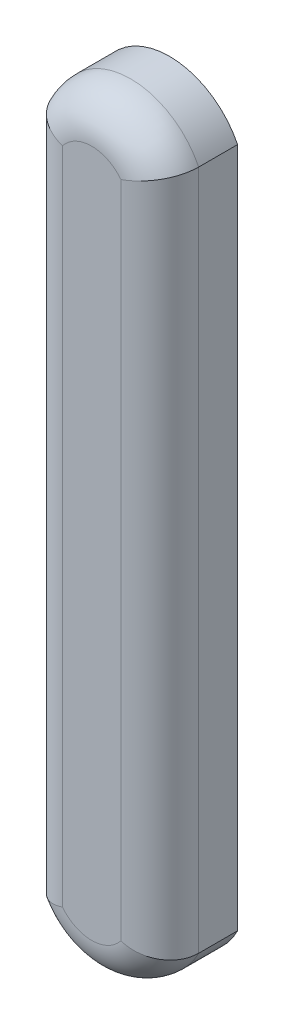
ISO-10303-21;
HEADER;
FILE_DESCRIPTION(('STEP AP214'),'2;1');
FILE_NAME('part.step','',(''),(''),'','','');
FILE_SCHEMA(('AUTOMOTIVE_DESIGN { 1 0 10303 214 1 1 1 1 }'));
ENDSEC;
DATA;
#1=APPLICATION_CONTEXT('core data for automotive mechanical design processes');
#2=APPLICATION_PROTOCOL_DEFINITION('international standard','automotive_design',2000,#1);
#3=PRODUCT_CONTEXT('',#1,'mechanical');
#4=PRODUCT('Part','Part','',(#3));
#5=PRODUCT_RELATED_PRODUCT_CATEGORY('part','',(#4));
#6=PRODUCT_DEFINITION_FORMATION('','',#4);
#7=PRODUCT_DEFINITION_CONTEXT('part definition',#1,'design');
#8=PRODUCT_DEFINITION('design','',#6,#7);
#9=PRODUCT_DEFINITION_SHAPE('','',#8);
#10=(LENGTH_UNIT() NAMED_UNIT(*) SI_UNIT(.MILLI.,.METRE.));
#11=(NAMED_UNIT(*) PLANE_ANGLE_UNIT() SI_UNIT($,.RADIAN.));
#12=(NAMED_UNIT(*) SI_UNIT($,.STERADIAN.) SOLID_ANGLE_UNIT());
#13=UNCERTAINTY_MEASURE_WITH_UNIT(LENGTH_MEASURE(1.E-05),#10,'distance_accuracy_value','');
#14=(GEOMETRIC_REPRESENTATION_CONTEXT(3) GLOBAL_UNCERTAINTY_ASSIGNED_CONTEXT((#13)) GLOBAL_UNIT_ASSIGNED_CONTEXT((#10,
#11,#12)) REPRESENTATION_CONTEXT('',''));
#15=CARTESIAN_POINT('',(0.,0.,0.));
#16=DIRECTION('',(0.,0.,1.));
#17=DIRECTION('',(1.,0.,0.));
#18=AXIS2_PLACEMENT_3D('',#15,#16,#17);
#19=CARTESIAN_POINT('',(0.175,0.085969826745946,0.2));
#20=DIRECTION('',(0.,0.,-1.));
#21=DIRECTION('',(-1.,0.,0.));
#22=AXIS2_PLACEMENT_3D('',#19,#20,#21);
#23=CYLINDRICAL_SURFACE('',#22,0.194976437321867);
#24=DIRECTION('',(0.,0.,-1.));
#25=VECTOR('',#24,1.);
#26=CARTESIAN_POINT('',(0.35,0.,0.2));
#27=LINE('',#26,#25);
#28=CARTESIAN_POINT('',(0.35,0.,0.1));
#29=VERTEX_POINT('',#28);
#30=CARTESIAN_POINT('',(0.35,0.,0.));
#31=VERTEX_POINT('',#30);
#32=EDGE_CURVE('E92',#29,#31,#27,.T.);
#33=ORIENTED_EDGE('',*,*,#32,.F.);
#34=CARTESIAN_POINT('',(0.175,0.085969826745946,0.1));
#35=DIRECTION('',(0.,0.,1.));
#36=DIRECTION('',(1.,0.,0.));
#37=AXIS2_PLACEMENT_3D('',#34,#35,#36);
#38=CIRCLE('',#37,0.194976437321867);
#39=CARTESIAN_POINT('',(0.,0.,0.1));
#40=VERTEX_POINT('',#39);
#41=EDGE_CURVE('E134',#29,#40,#38,.F.);
#42=ORIENTED_EDGE('',*,*,#41,.T.);
#43=DIRECTION('',(0.,0.,-1.));
#44=VECTOR('',#43,1.);
#45=CARTESIAN_POINT('',(0.,0.,0.2));
#46=LINE('',#45,#44);
#47=CARTESIAN_POINT('',(0.,0.,0.));
#48=VERTEX_POINT('',#47);
#49=EDGE_CURVE('E113',#40,#48,#46,.T.);
#50=ORIENTED_EDGE('',*,*,#49,.T.);
#51=CARTESIAN_POINT('',(0.175,0.085969826745946,0.));
#52=DIRECTION('',(0.,0.,1.));
#53=DIRECTION('',(1.,0.,0.));
#54=AXIS2_PLACEMENT_3D('',#51,#52,#53);
#55=CIRCLE('',#54,0.194976437321867);
#56=EDGE_CURVE('E109',#48,#31,#55,.T.);
#57=ORIENTED_EDGE('',*,*,#56,.T.);
#58=EDGE_LOOP('',(#33,#42,#50,#57));
#59=FACE_BOUND('',#58,.T.);
#60=ADVANCED_FACE('F33',(#59),#23,.T.);
#61=CARTESIAN_POINT('',(0.35,0.,0.2));
#62=DIRECTION('',(-1.,0.,0.));
#63=DIRECTION('',(0.,0.,1.));
#64=AXIS2_PLACEMENT_3D('',#61,#62,#63);
#65=PLANE('',#64);
#66=DIRECTION('',(0.,0.,-1.));
#67=VECTOR('',#66,1.);
#68=CARTESIAN_POINT('',(0.35,1.75,0.2));
#69=LINE('',#68,#67);
#70=CARTESIAN_POINT('',(0.35,1.75,0.1));
#71=VERTEX_POINT('',#70);
#72=CARTESIAN_POINT('',(0.35,1.75,0.));
#73=VERTEX_POINT('',#72);
#74=EDGE_CURVE('E103',#71,#73,#69,.T.);
#75=ORIENTED_EDGE('',*,*,#74,.F.);
#76=DIRECTION('',(0.,1.,0.));
#77=VECTOR('',#76,1.);
#78=CARTESIAN_POINT('',(0.35,0.,0.1));
#79=LINE('',#78,#77);
#80=EDGE_CURVE('E47',#71,#29,#79,.F.);
#81=ORIENTED_EDGE('',*,*,#80,.T.);
#82=ORIENTED_EDGE('',*,*,#32,.T.);
#83=DIRECTION('',(0.,1.,0.));
#84=VECTOR('',#83,1.);
#85=CARTESIAN_POINT('',(0.35,0.,0.));
#86=LINE('',#85,#84);
#87=EDGE_CURVE('E95',#31,#73,#86,.T.);
#88=ORIENTED_EDGE('',*,*,#87,.T.);
#89=EDGE_LOOP('',(#75,#81,#82,#88));
#90=FACE_BOUND('',#89,.T.);
#91=ADVANCED_FACE('F94',(#90),#65,.F.);
#92=CARTESIAN_POINT('',(0.175,1.66403017325405,0.2));
#93=DIRECTION('',(0.,0.,-1.));
#94=DIRECTION('',(-1.,0.,0.));
#95=AXIS2_PLACEMENT_3D('',#92,#93,#94);
#96=CYLINDRICAL_SURFACE('',#95,0.194976437321867);
#97=DIRECTION('',(0.,0.,-1.));
#98=VECTOR('',#97,1.);
#99=CARTESIAN_POINT('',(0.,1.75,0.2));
#100=LINE('',#99,#98);
#101=CARTESIAN_POINT('',(0.,1.75,0.1));
#102=VERTEX_POINT('',#101);
#103=CARTESIAN_POINT('',(0.,1.75,0.));
#104=VERTEX_POINT('',#103);
#105=EDGE_CURVE('E123',#102,#104,#100,.T.);
#106=ORIENTED_EDGE('',*,*,#105,.F.);
#107=CARTESIAN_POINT('',(0.175,1.66403017325405,0.1));
#108=DIRECTION('',(0.,0.,1.));
#109=DIRECTION('',(1.,0.,0.));
#110=AXIS2_PLACEMENT_3D('',#107,#108,#109);
#111=CIRCLE('',#110,0.194976437321867);
#112=EDGE_CURVE('E11',#102,#71,#111,.F.);
#113=ORIENTED_EDGE('',*,*,#112,.T.);
#114=ORIENTED_EDGE('',*,*,#74,.T.);
#115=CARTESIAN_POINT('',(0.175,1.66403017325405,0.));
#116=DIRECTION('',(0.,0.,1.));
#117=DIRECTION('',(-1.,0.,0.));
#118=AXIS2_PLACEMENT_3D('',#115,#116,#117);
#119=CIRCLE('',#118,0.194976437321867);
#120=EDGE_CURVE('E111',#73,#104,#119,.T.);
#121=ORIENTED_EDGE('',*,*,#120,.T.);
#122=EDGE_LOOP('',(#106,#113,#114,#121));
#123=FACE_BOUND('',#122,.T.);
#124=ADVANCED_FACE('F176',(#123),#96,.T.);
#125=CARTESIAN_POINT('',(0.,0.,0.2));
#126=DIRECTION('',(1.,0.,0.));
#127=DIRECTION('',(0.,0.,-1.));
#128=AXIS2_PLACEMENT_3D('',#125,#126,#127);
#129=PLANE('',#128);
#130=ORIENTED_EDGE('',*,*,#49,.F.);
#131=DIRECTION('',(0.,-1.,0.));
#132=VECTOR('',#131,1.);
#133=CARTESIAN_POINT('',(0.,1.75,0.1));
#134=LINE('',#133,#132);
#135=EDGE_CURVE('E61',#40,#102,#134,.F.);
#136=ORIENTED_EDGE('',*,*,#135,.T.);
#137=ORIENTED_EDGE('',*,*,#105,.T.);
#138=DIRECTION('',(0.,-1.,0.));
#139=VECTOR('',#138,1.);
#140=CARTESIAN_POINT('',(0.,0.,0.));
#141=LINE('',#140,#139);
#142=EDGE_CURVE('E120',#104,#48,#141,.T.);
#143=ORIENTED_EDGE('',*,*,#142,.T.);
#144=EDGE_LOOP('',(#130,#136,#137,#143));
#145=FACE_BOUND('',#144,.T.);
#146=ADVANCED_FACE('F175',(#145),#129,.F.);
#147=CARTESIAN_POINT('',(0.175,0.085969826745946,0.2));
#148=DIRECTION('',(0.,0.,1.));
#149=DIRECTION('',(1.,0.,0.));
#150=AXIS2_PLACEMENT_3D('',#147,#148,#149);
#151=PLANE('',#150);
#152=DIRECTION('',(0.,-1.,0.));
#153=VECTOR('',#152,1.);
#154=CARTESIAN_POINT('',(0.1,0.,0.2));
#155=LINE('',#154,#153);
#156=CARTESIAN_POINT('',(0.100000000000006,1.72230129514437,0.2));
#157=VERTEX_POINT('',#156);
#158=CARTESIAN_POINT('',(0.1,0.0276987048556349,0.2));
#159=VERTEX_POINT('',#158);
#160=EDGE_CURVE('E129',#157,#159,#155,.T.);
#161=ORIENTED_EDGE('',*,*,#160,.T.);
#162=CARTESIAN_POINT('',(0.175,0.085969826745946,0.2));
#163=DIRECTION('',(0.,0.,1.));
#164=DIRECTION('',(1.,0.,0.));
#165=AXIS2_PLACEMENT_3D('',#162,#163,#164);
#166=CIRCLE('',#165,0.0949764373218671);
#167=CARTESIAN_POINT('',(0.25,0.027698704855635,0.2));
#168=VERTEX_POINT('',#167);
#169=EDGE_CURVE('E131',#159,#168,#166,.T.);
#170=ORIENTED_EDGE('',*,*,#169,.T.);
#171=DIRECTION('',(0.,1.,0.));
#172=VECTOR('',#171,1.);
#173=CARTESIAN_POINT('',(0.25,1.75,0.2));
#174=LINE('',#173,#172);
#175=CARTESIAN_POINT('',(0.249999999999994,1.72230129514437,0.2));
#176=VERTEX_POINT('',#175);
#177=EDGE_CURVE('E127',#168,#176,#174,.T.);
#178=ORIENTED_EDGE('',*,*,#177,.T.);
#179=CARTESIAN_POINT('',(0.175,1.66403017325405,0.2));
#180=DIRECTION('',(0.,0.,1.));
#181=DIRECTION('',(1.,0.,0.));
#182=AXIS2_PLACEMENT_3D('',#179,#180,#181);
#183=CIRCLE('',#182,0.0949764373218671);
#184=EDGE_CURVE('E102',#176,#157,#183,.T.);
#185=ORIENTED_EDGE('',*,*,#184,.T.);
#186=EDGE_LOOP('',(#161,#170,#178,#185));
#187=FACE_BOUND('',#186,.T.);
#188=ADVANCED_FACE('F180',(#187),#151,.T.);
#189=CARTESIAN_POINT('',(0.175,0.085969826745946,0.));
#190=DIRECTION('',(0.,0.,1.));
#191=DIRECTION('',(1.,0.,0.));
#192=AXIS2_PLACEMENT_3D('',#189,#190,#191);
#193=PLANE('',#192);
#194=ORIENTED_EDGE('',*,*,#56,.F.);
#195=ORIENTED_EDGE('',*,*,#142,.F.);
#196=ORIENTED_EDGE('',*,*,#120,.F.);
#197=ORIENTED_EDGE('',*,*,#87,.F.);
#198=EDGE_LOOP('',(#194,#195,#196,#197));
#199=FACE_BOUND('',#198,.T.);
#200=ADVANCED_FACE('F107',(#199),#193,.F.);
#201=CARTESIAN_POINT('',(0.175,1.66403017325405,0.1));
#202=DIRECTION('',(0.,0.,1.));
#203=DIRECTION('',(1.,0.,0.));
#204=AXIS2_PLACEMENT_3D('',#201,#202,#203);
#205=DEGENERATE_TOROIDAL_SURFACE('',#204,0.0949764373218671,0.1,.T.);
#206=CARTESIAN_POINT('',(0.35,1.75,0.1));
#207=CARTESIAN_POINT('',(0.350005268670267,1.75000040754592,0.105511252154056));
#208=CARTESIAN_POINT('',(0.349544726083473,1.74989418803524,0.111020433796739));
#209=CARTESIAN_POINT('',(0.347731528858172,1.74947173953325,0.121874551323155));
#210=CARTESIAN_POINT('',(0.346380049196348,1.74915578713593,0.127219693839957));
#211=CARTESIAN_POINT('',(0.342823791248484,1.74831698281915,0.137602422816504));
#212=CARTESIAN_POINT('',(0.340618769337371,1.7477940718269,0.142639920990146));
#213=CARTESIAN_POINT('',(0.335428566635515,1.74654702816146,0.152267062418119));
#214=CARTESIAN_POINT('',(0.332443445191162,1.74582291079487,0.156856739704145));
#215=CARTESIAN_POINT('',(0.325756614399063,1.74417319123095,0.165506423196409));
#216=CARTESIAN_POINT('',(0.322048708236536,1.74324583736037,0.169561300463762));
#217=CARTESIAN_POINT('',(0.314048358880856,1.74120195336536,0.176991039421652));
#218=CARTESIAN_POINT('',(0.309755728604854,1.74008536266644,0.18036568261043));
#219=CARTESIAN_POINT('',(0.300608968757441,1.7376441832273,0.186426554884238));
#220=CARTESIAN_POINT('',(0.295743946563813,1.73631529375002,0.189094582015617));
#221=CARTESIAN_POINT('',(0.285685701853069,1.73347998727226,0.193577836216799));
#222=CARTESIAN_POINT('',(0.280492611405467,1.73197364150132,0.195393404007875));
#223=CARTESIAN_POINT('',(0.271464682749297,1.72925574089153,0.197746196020681));
#224=CARTESIAN_POINT('',(0.267672328405755,1.72808525366685,0.198501401199194));
#225=CARTESIAN_POINT('',(0.260055477527481,1.72566401718499,0.199567195235984));
#226=CARTESIAN_POINT('',(0.25623103898922,1.72441339335639,0.199878461996796));
#227=CARTESIAN_POINT('',(0.251610866919887,1.72285157075458,0.199990299901761));
#228=CARTESIAN_POINT('',(0.250805058561448,1.72257728559771,0.200000031817378));
#229=CARTESIAN_POINT('',(0.25,1.72230129514436,0.2));
#230=B_SPLINE_CURVE_WITH_KNOTS('',3,(#206,#207,#208,#209,#210,#211,#212,#213,#214,#215,#216,
#217,#218,#219,#220,#221,#222,#223,#224,#225,#226,#227,#228,#229),.UNSPECIFIED.,.F.,.F.,(4,2,2,
2,2,2,2,2,2,2,2,4),(0.,0.0165104363716612,0.0329991420587915,0.0494925575628399,
0.0659847186886619,0.0826250435228637,0.0992707050000555,0.116310692768043,0.133343863977416,
0.145441145514401,0.157519934417857,0.160073462740983),.UNSPECIFIED.);
#231=EDGE_CURVE('E117',#71,#176,#230,.T.);
#232=ORIENTED_EDGE('',*,*,#231,.F.);
#233=ORIENTED_EDGE('',*,*,#112,.F.);
#234=CARTESIAN_POINT('',(0.,1.75,0.1));
#235=CARTESIAN_POINT('',(-5.26867026747436E-06,1.75000040754592,0.105511252154056));
#236=CARTESIAN_POINT('',(0.00045527391652668,1.74989418803524,0.111020433796739));
#237=CARTESIAN_POINT('',(0.00226847114182761,1.74947173953325,0.121874551323155));
#238=CARTESIAN_POINT('',(0.00361995080365192,1.74915578713593,0.127219693839957));
#239=CARTESIAN_POINT('',(0.00717620875151555,1.74831698281915,0.137602422816504));
#240=CARTESIAN_POINT('',(0.00938123066262876,1.7477940718269,0.142639920990146));
#241=CARTESIAN_POINT('',(0.0145714333644853,1.74654702816146,0.152267062418119));
#242=CARTESIAN_POINT('',(0.0175565548088385,1.74582291079487,0.156856739704144));
#243=CARTESIAN_POINT('',(0.0242433856009374,1.74417319123095,0.165506423196409));
#244=CARTESIAN_POINT('',(0.0279512917634644,1.74324583736037,0.169561300463762));
#245=CARTESIAN_POINT('',(0.0359516411191435,1.74120195336536,0.176991039421652));
#246=CARTESIAN_POINT('',(0.0402442713951461,1.74008536266644,0.18036568261043));
#247=CARTESIAN_POINT('',(0.0493910312425594,1.7376441832273,0.186426554884238));
#248=CARTESIAN_POINT('',(0.0542560534361864,1.73631529375002,0.189094582015616));
#249=CARTESIAN_POINT('',(0.0643142981469308,1.73347998727226,0.193577836216799));
#250=CARTESIAN_POINT('',(0.0695073885945331,1.73197364150132,0.195393404007875));
#251=CARTESIAN_POINT('',(0.078535317250703,1.72925574089153,0.197746196020681));
#252=CARTESIAN_POINT('',(0.0823276715942444,1.72808525366685,0.198501401199194));
#253=CARTESIAN_POINT('',(0.089944522472519,1.72566401718499,0.199567195235984));
#254=CARTESIAN_POINT('',(0.09376896101078,1.72441339335639,0.199878461996796));
#255=CARTESIAN_POINT('',(0.0983891330801134,1.72285157075458,0.199990299901761));
#256=CARTESIAN_POINT('',(0.0991949414385525,1.72257728559771,0.200000031817378));
#257=CARTESIAN_POINT('',(0.1,1.72230129514436,0.2));
#258=B_SPLINE_CURVE_WITH_KNOTS('',3,(#234,#235,#236,#237,#238,#239,#240,#241,#242,#243,#244,
#245,#246,#247,#248,#249,#250,#251,#252,#253,#254,#255,#256,#257),.UNSPECIFIED.,.F.,.F.,(4,2,2,
2,2,2,2,2,2,2,2,4),(0.,0.0165104363716612,0.0329991420587914,0.0494925575628399,
0.0659847186886619,0.0826250435228636,0.0992707050000554,0.116310692768043,0.133343863977416,
0.145441145514401,0.157519934417857,0.160073462740983),.UNSPECIFIED.);
#259=EDGE_CURVE('E38',#157,#102,#258,.F.);
#260=ORIENTED_EDGE('',*,*,#259,.F.);
#261=ORIENTED_EDGE('',*,*,#184,.F.);
#262=EDGE_LOOP('',(#232,#233,#260,#261));
#263=FACE_BOUND('',#262,.T.);
#264=ADVANCED_FACE('F35',(#263),#205,.T.);
#265=CARTESIAN_POINT('',(0.1,0.085969826745946,0.1));
#266=DIRECTION('',(0.,1.,0.));
#267=DIRECTION('',(0.,0.,1.));
#268=AXIS2_PLACEMENT_3D('',#265,#266,#267);
#269=CYLINDRICAL_SURFACE('',#268,0.1);
#270=ORIENTED_EDGE('',*,*,#259,.T.);
#271=ORIENTED_EDGE('',*,*,#135,.F.);
#272=CARTESIAN_POINT('',(0.,0.,0.1));
#273=CARTESIAN_POINT('',(-5.26867026746398E-06,-4.07545918080694E-07,0.105511252154056));
#274=CARTESIAN_POINT('',(0.000455273916526692,0.000105811964755442,0.111020433796739));
#275=CARTESIAN_POINT('',(0.00226847114182762,0.000528260466754622,0.121874551323155));
#276=CARTESIAN_POINT('',(0.00361995080365192,0.000844212864070088,0.127219693839957));
#277=CARTESIAN_POINT('',(0.00717620875151555,0.00168301718085008,0.137602422816504));
#278=CARTESIAN_POINT('',(0.00938123066262875,0.00220592817310269,0.142639920990146));
#279=CARTESIAN_POINT('',(0.0145714333644852,0.00345297183853682,0.152267062418119));
#280=CARTESIAN_POINT('',(0.0175565548088385,0.00417708920512641,0.156856739704144));
#281=CARTESIAN_POINT('',(0.0242433856009374,0.00582680876905415,0.165506423196409));
#282=CARTESIAN_POINT('',(0.0279512917634644,0.00675416263962724,0.169561300463762));
#283=CARTESIAN_POINT('',(0.0359516411191436,0.00879804663464378,0.176991039421652));
#284=CARTESIAN_POINT('',(0.0402442713951461,0.0099146373335641,0.18036568261043));
#285=CARTESIAN_POINT('',(0.0493910312425594,0.0123558167727031,0.186426554884238));
#286=CARTESIAN_POINT('',(0.0542560534361864,0.0136847062499834,0.189094582015616));
#287=CARTESIAN_POINT('',(0.0643142981469308,0.0165200127277396,0.193577836216799));
#288=CARTESIAN_POINT('',(0.0695073885945331,0.0180263584986781,0.195393404007875));
#289=CARTESIAN_POINT('',(0.078535317250703,0.0207442591084678,0.197746196020681));
#290=CARTESIAN_POINT('',(0.0823276715942444,0.0219147463331537,0.198501401199194));
#291=CARTESIAN_POINT('',(0.089944522472519,0.0243359828150114,0.199567195235984));
#292=CARTESIAN_POINT('',(0.09376896101078,0.0255866066436067,0.199878461996796));
#293=CARTESIAN_POINT('',(0.0983891330801134,0.027148429245421,0.199990299901761));
#294=CARTESIAN_POINT('',(0.0991949414385525,0.0274227144022898,0.200000031817378));
#295=CARTESIAN_POINT('',(0.1,0.027698704855643,0.2));
#296=B_SPLINE_CURVE_WITH_KNOTS('',3,(#272,#273,#274,#275,#276,#277,#278,#279,#280,#281,#282,
#283,#284,#285,#286,#287,#288,#289,#290,#291,#292,#293,#294,#295),.UNSPECIFIED.,.F.,.F.,(4,2,2,
2,2,2,2,2,2,2,2,4),(0.,0.0165104363716612,0.0329991420587914,0.0494925575628399,
0.0659847186886619,0.0826250435228636,0.0992707050000554,0.116310692768043,0.133343863977416,
0.145441145514401,0.157519934417857,0.160073462740983),.UNSPECIFIED.);
#297=EDGE_CURVE('E146',#159,#40,#296,.F.);
#298=ORIENTED_EDGE('',*,*,#297,.F.);
#299=ORIENTED_EDGE('',*,*,#160,.F.);
#300=EDGE_LOOP('',(#270,#271,#298,#299));
#301=FACE_BOUND('',#300,.T.);
#302=ADVANCED_FACE('F157',(#301),#269,.T.);
#303=CARTESIAN_POINT('',(0.25,0.085969826745946,0.1));
#304=DIRECTION('',(0.,-1.,0.));
#305=DIRECTION('',(0.,0.,-1.));
#306=AXIS2_PLACEMENT_3D('',#303,#304,#305);
#307=CYLINDRICAL_SURFACE('',#306,0.1);
#308=ORIENTED_EDGE('',*,*,#231,.T.);
#309=ORIENTED_EDGE('',*,*,#177,.F.);
#310=CARTESIAN_POINT('',(0.35,0.,0.1));
#311=CARTESIAN_POINT('',(0.350005268670267,-4.07545917791526E-07,0.105511252154056));
#312=CARTESIAN_POINT('',(0.349544726083473,0.000105811964755741,0.111020433796739));
#313=CARTESIAN_POINT('',(0.347731528858172,0.000528260466754901,0.121874551323155));
#314=CARTESIAN_POINT('',(0.346380049196348,0.000844212864070338,0.127219693839957));
#315=CARTESIAN_POINT('',(0.342823791248484,0.00168301718085032,0.137602422816504));
#316=CARTESIAN_POINT('',(0.340618769337371,0.00220592817310294,0.142639920990146));
#317=CARTESIAN_POINT('',(0.335428566635515,0.00345297183853705,0.152267062418119));
#318=CARTESIAN_POINT('',(0.332443445191162,0.0041770892051266,0.156856739704144));
#319=CARTESIAN_POINT('',(0.325756614399063,0.00582680876905436,0.165506423196409));
#320=CARTESIAN_POINT('',(0.322048708236536,0.00675416263962749,0.169561300463762));
#321=CARTESIAN_POINT('',(0.314048358880856,0.00879804663464403,0.176991039421652));
#322=CARTESIAN_POINT('',(0.309755728604854,0.00991463733356431,0.18036568261043));
#323=CARTESIAN_POINT('',(0.300608968757441,0.0123558167727034,0.186426554884238));
#324=CARTESIAN_POINT('',(0.295743946563814,0.0136847062499836,0.189094582015616));
#325=CARTESIAN_POINT('',(0.285685701853069,0.0165200127277399,0.193577836216799));
#326=CARTESIAN_POINT('',(0.280492611405467,0.0180263584986783,0.195393404007875));
#327=CARTESIAN_POINT('',(0.271464682749297,0.020744259108468,0.197746196020681));
#328=CARTESIAN_POINT('',(0.267672328405756,0.021914746333154,0.198501401199194));
#329=CARTESIAN_POINT('',(0.260055477527481,0.0243359828150116,0.199567195235984));
#330=CARTESIAN_POINT('',(0.25623103898922,0.0255866066436069,0.199878461996796));
#331=CARTESIAN_POINT('',(0.251610866919887,0.0271484292454212,0.199990299901761));
#332=CARTESIAN_POINT('',(0.250805058561448,0.02742271440229,0.200000031817378));
#333=CARTESIAN_POINT('',(0.25,0.0276987048556431,0.2));
#334=B_SPLINE_CURVE_WITH_KNOTS('',3,(#310,#311,#312,#313,#314,#315,#316,#317,#318,#319,#320,
#321,#322,#323,#324,#325,#326,#327,#328,#329,#330,#331,#332,#333),.UNSPECIFIED.,.F.,.F.,(4,2,2,
2,2,2,2,2,2,2,2,4),(0.,0.0165104363716612,0.0329991420587914,0.0494925575628399,
0.0659847186886619,0.0826250435228637,0.0992707050000554,0.116310692768043,0.133343863977416,
0.145441145514401,0.157519934417857,0.160073462740983),.UNSPECIFIED.);
#335=EDGE_CURVE('E138',#29,#168,#334,.T.);
#336=ORIENTED_EDGE('',*,*,#335,.F.);
#337=ORIENTED_EDGE('',*,*,#80,.F.);
#338=EDGE_LOOP('',(#308,#309,#336,#337));
#339=FACE_BOUND('',#338,.T.);
#340=ADVANCED_FACE('F154',(#339),#307,.T.);
#341=CARTESIAN_POINT('',(0.175,0.085969826745946,0.1));
#342=DIRECTION('',(0.,0.,1.));
#343=DIRECTION('',(1.,0.,0.));
#344=AXIS2_PLACEMENT_3D('',#341,#342,#343);
#345=DEGENERATE_TOROIDAL_SURFACE('',#344,0.0949764373218671,0.1,.T.);
#346=ORIENTED_EDGE('',*,*,#297,.T.);
#347=ORIENTED_EDGE('',*,*,#41,.F.);
#348=ORIENTED_EDGE('',*,*,#335,.T.);
#349=ORIENTED_EDGE('',*,*,#169,.F.);
#350=EDGE_LOOP('',(#346,#347,#348,#349));
#351=FACE_BOUND('',#350,.T.);
#352=ADVANCED_FACE('F151',(#351),#345,.T.);
#353=CLOSED_SHELL('',(#60,#91,#124,#146,#188,#200,#264,#302,#340,#352));
#354=MANIFOLD_SOLID_BREP('B2',#353);
#355=ADVANCED_BREP_SHAPE_REPRESENTATION('',(#18,#354),#14);
#356=SHAPE_DEFINITION_REPRESENTATION(#9,#355);
ENDSEC;
END-ISO-10303-21;
